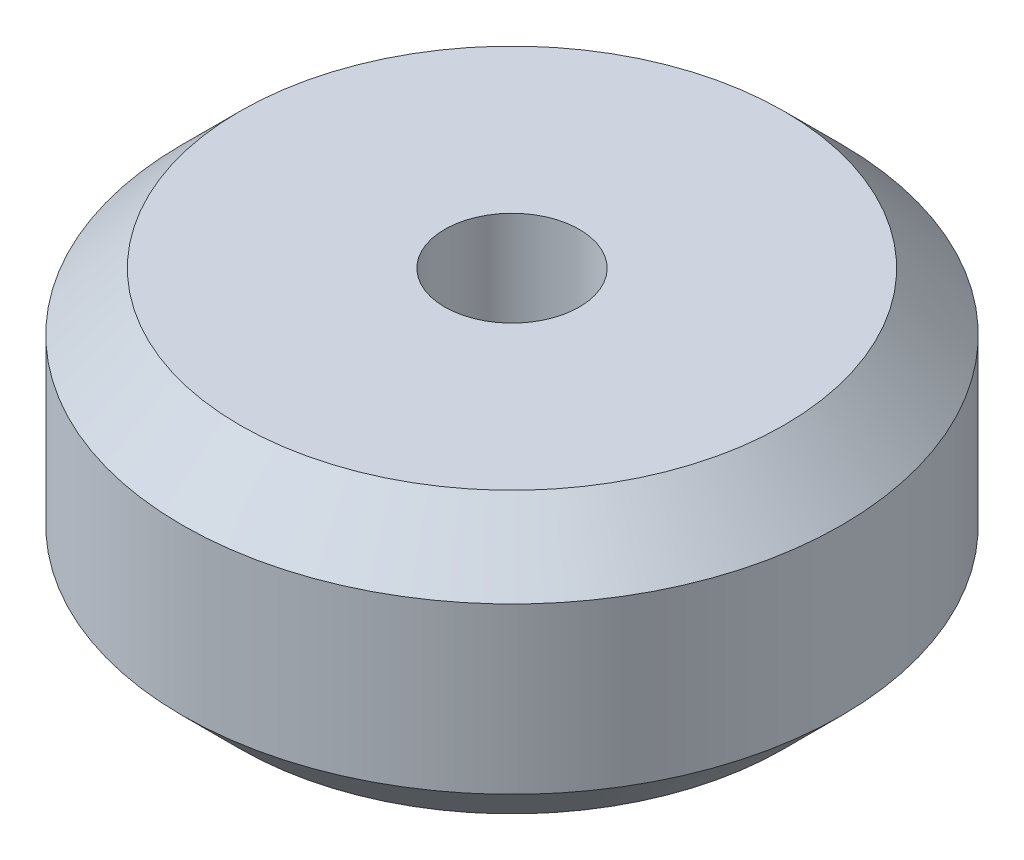
ISO-10303-21;
HEADER;
FILE_DESCRIPTION(('STEP AP214'),'2;1');
FILE_NAME('part.step','',(''),(''),'','','');
FILE_SCHEMA(('AUTOMOTIVE_DESIGN { 1 0 10303 214 1 1 1 1 }'));
ENDSEC;
DATA;
#1=APPLICATION_CONTEXT('core data for automotive mechanical design processes');
#2=APPLICATION_PROTOCOL_DEFINITION('international standard','automotive_design',2000,#1);
#3=PRODUCT_CONTEXT('',#1,'mechanical');
#4=PRODUCT('Part','Part','',(#3));
#5=PRODUCT_RELATED_PRODUCT_CATEGORY('part','',(#4));
#6=PRODUCT_DEFINITION_FORMATION('','',#4);
#7=PRODUCT_DEFINITION_CONTEXT('part definition',#1,'design');
#8=PRODUCT_DEFINITION('design','',#6,#7);
#9=PRODUCT_DEFINITION_SHAPE('','',#8);
#10=(LENGTH_UNIT() NAMED_UNIT(*) SI_UNIT(.MILLI.,.METRE.));
#11=(NAMED_UNIT(*) PLANE_ANGLE_UNIT() SI_UNIT($,.RADIAN.));
#12=(NAMED_UNIT(*) SI_UNIT($,.STERADIAN.) SOLID_ANGLE_UNIT());
#13=UNCERTAINTY_MEASURE_WITH_UNIT(LENGTH_MEASURE(1.E-05),#10,'distance_accuracy_value','');
#14=(GEOMETRIC_REPRESENTATION_CONTEXT(3) GLOBAL_UNCERTAINTY_ASSIGNED_CONTEXT((#13)) GLOBAL_UNIT_ASSIGNED_CONTEXT((#10,
#11,#12)) REPRESENTATION_CONTEXT('',''));
#15=CARTESIAN_POINT('',(0.,0.,0.));
#16=DIRECTION('',(0.,0.,1.));
#17=DIRECTION('',(1.,0.,0.));
#18=AXIS2_PLACEMENT_3D('',#15,#16,#17);
#19=CARTESIAN_POINT('',(0.,5.1,0.));
#20=DIRECTION('',(0.,-1.,0.));
#21=DIRECTION('',(0.,0.,-1.));
#22=AXIS2_PLACEMENT_3D('',#19,#20,#21);
#23=CYLINDRICAL_SURFACE('',#22,12.);
#24=CARTESIAN_POINT('',(0.,-3.,0.));
#25=DIRECTION('',(0.,1.,0.));
#26=DIRECTION('',(0.,0.,1.));
#27=AXIS2_PLACEMENT_3D('',#24,#25,#26);
#28=CIRCLE('',#27,12.);
#29=CARTESIAN_POINT('',(0.,-3.,12.));
#30=VERTEX_POINT('',#29);
#31=EDGE_CURVE('E46',#30,#30,#28,.T.);
#32=ORIENTED_EDGE('',*,*,#31,.T.);
#33=EDGE_LOOP('',(#32));
#34=FACE_BOUND('',#33,.T.);
#35=CARTESIAN_POINT('',(0.,2.99999999999999,0.));
#36=DIRECTION('',(0.,1.,0.));
#37=DIRECTION('',(0.,0.,1.));
#38=AXIS2_PLACEMENT_3D('',#35,#36,#37);
#39=CIRCLE('',#38,12.);
#40=CARTESIAN_POINT('',(0.,2.99999999999999,-12.));
#41=VERTEX_POINT('',#40);
#42=EDGE_CURVE('E50',#41,#41,#39,.F.);
#43=ORIENTED_EDGE('',*,*,#42,.T.);
#44=EDGE_LOOP('',(#43));
#45=FACE_BOUND('',#44,.T.);
#46=ADVANCED_FACE('F34',(#34,#45),#23,.T.);
#47=CARTESIAN_POINT('',(0.,5.1,0.));
#48=DIRECTION('',(0.,1.,0.));
#49=DIRECTION('',(0.,0.,1.));
#50=AXIS2_PLACEMENT_3D('',#47,#48,#49);
#51=PLANE('',#50);
#52=CARTESIAN_POINT('',(0.,5.1,0.));
#53=DIRECTION('',(0.,1.,0.));
#54=DIRECTION('',(0.,0.,1.));
#55=AXIS2_PLACEMENT_3D('',#52,#53,#54);
#56=CIRCLE('',#55,2.45);
#57=CARTESIAN_POINT('',(0.,5.1,2.45));
#58=VERTEX_POINT('',#57);
#59=EDGE_CURVE('E58',#58,#58,#56,.T.);
#60=ORIENTED_EDGE('',*,*,#59,.F.);
#61=EDGE_LOOP('',(#60));
#62=FACE_BOUND('',#61,.T.);
#63=CARTESIAN_POINT('',(0.,5.1,0.));
#64=DIRECTION('',(0.,1.,0.));
#65=DIRECTION('',(0.,0.,1.));
#66=AXIS2_PLACEMENT_3D('',#63,#64,#65);
#67=CIRCLE('',#66,9.9);
#68=CARTESIAN_POINT('',(0.,5.1,-9.9));
#69=VERTEX_POINT('',#68);
#70=EDGE_CURVE('E10',#69,#69,#67,.T.);
#71=ORIENTED_EDGE('',*,*,#70,.T.);
#72=EDGE_LOOP('',(#71));
#73=FACE_BOUND('',#72,.T.);
#74=ADVANCED_FACE('F64',(#62,#73),#51,.T.);
#75=CARTESIAN_POINT('',(0.,-5.1,0.));
#76=DIRECTION('',(0.,1.,0.));
#77=DIRECTION('',(0.,0.,1.));
#78=AXIS2_PLACEMENT_3D('',#75,#76,#77);
#79=PLANE('',#78);
#80=CARTESIAN_POINT('',(0.,-5.1,0.));
#81=DIRECTION('',(0.,1.,0.));
#82=DIRECTION('',(0.,0.,1.));
#83=AXIS2_PLACEMENT_3D('',#80,#81,#82);
#84=CIRCLE('',#83,2.45);
#85=CARTESIAN_POINT('',(0.,-5.1,2.45));
#86=VERTEX_POINT('',#85);
#87=EDGE_CURVE('E55',#86,#86,#84,.T.);
#88=ORIENTED_EDGE('',*,*,#87,.T.);
#89=EDGE_LOOP('',(#88));
#90=FACE_BOUND('',#89,.T.);
#91=CARTESIAN_POINT('',(0.,-5.1,0.));
#92=DIRECTION('',(0.,1.,0.));
#93=DIRECTION('',(0.,0.,1.));
#94=AXIS2_PLACEMENT_3D('',#91,#92,#93);
#95=CIRCLE('',#94,9.9);
#96=CARTESIAN_POINT('',(0.,-5.1,9.9));
#97=VERTEX_POINT('',#96);
#98=EDGE_CURVE('E42',#97,#97,#95,.F.);
#99=ORIENTED_EDGE('',*,*,#98,.T.);
#100=EDGE_LOOP('',(#99));
#101=FACE_BOUND('',#100,.T.);
#102=ADVANCED_FACE('F66',(#90,#101),#79,.F.);
#103=CARTESIAN_POINT('',(0.,-3.,0.));
#104=DIRECTION('',(0.,1.,0.));
#105=DIRECTION('',(0.,0.,1.));
#106=AXIS2_PLACEMENT_3D('',#103,#104,#105);
#107=CONICAL_SURFACE('',#106,12.,0.78539816339745);
#108=ORIENTED_EDGE('',*,*,#98,.F.);
#109=EDGE_LOOP('',(#108));
#110=FACE_BOUND('',#109,.T.);
#111=ORIENTED_EDGE('',*,*,#31,.F.);
#112=EDGE_LOOP('',(#111));
#113=FACE_BOUND('',#112,.T.);
#114=ADVANCED_FACE('F72',(#110,#113),#107,.T.);
#115=CARTESIAN_POINT('',(0.,5.1,0.));
#116=DIRECTION('',(0.,-1.,0.));
#117=DIRECTION('',(0.,0.,-1.));
#118=AXIS2_PLACEMENT_3D('',#115,#116,#117);
#119=CONICAL_SURFACE('',#118,9.9,0.785398163397446);
#120=CARTESIAN_POINT('',(0.,2.99999999999999,-12.));
#121=CARTESIAN_POINT('',(0.,3.02187499999999,-11.978125));
#122=CARTESIAN_POINT('',(0.,3.04374999999999,-11.95625));
#123=CARTESIAN_POINT('',(0.,3.08749999999999,-11.9125));
#124=CARTESIAN_POINT('',(0.,3.10937499999999,-11.890625));
#125=CARTESIAN_POINT('',(0.,3.15312499999999,-11.846875));
#126=CARTESIAN_POINT('',(0.,3.17499999999999,-11.825));
#127=CARTESIAN_POINT('',(0.,3.21874999999999,-11.78125));
#128=CARTESIAN_POINT('',(0.,3.24062499999999,-11.759375));
#129=CARTESIAN_POINT('',(0.,3.28437499999999,-11.715625));
#130=CARTESIAN_POINT('',(0.,3.30624999999999,-11.69375));
#131=CARTESIAN_POINT('',(0.,3.34999999999999,-11.65));
#132=CARTESIAN_POINT('',(0.,3.37187499999999,-11.628125));
#133=CARTESIAN_POINT('',(0.,3.41562499999999,-11.584375));
#134=CARTESIAN_POINT('',(0.,3.43749999999999,-11.5625));
#135=CARTESIAN_POINT('',(0.,3.48124999999999,-11.51875));
#136=CARTESIAN_POINT('',(0.,3.50312499999999,-11.496875));
#137=CARTESIAN_POINT('',(0.,3.54687499999999,-11.453125));
#138=CARTESIAN_POINT('',(0.,3.56874999999999,-11.43125));
#139=CARTESIAN_POINT('',(0.,3.61249999999999,-11.3875));
#140=CARTESIAN_POINT('',(0.,3.63437499999999,-11.365625));
#141=CARTESIAN_POINT('',(0.,3.67812499999999,-11.321875));
#142=CARTESIAN_POINT('',(0.,3.69999999999999,-11.3));
#143=CARTESIAN_POINT('',(0.,3.74374999999999,-11.25625));
#144=CARTESIAN_POINT('',(0.,3.76562499999999,-11.234375));
#145=CARTESIAN_POINT('',(0.,3.80937499999999,-11.190625));
#146=CARTESIAN_POINT('',(0.,3.83124999999999,-11.16875));
#147=CARTESIAN_POINT('',(0.,3.87499999999999,-11.125));
#148=CARTESIAN_POINT('',(0.,3.89687499999999,-11.103125));
#149=CARTESIAN_POINT('',(0.,3.94062499999999,-11.059375));
#150=CARTESIAN_POINT('',(0.,3.96249999999999,-11.0375));
#151=CARTESIAN_POINT('',(0.,4.00624999999999,-10.99375));
#152=CARTESIAN_POINT('',(0.,4.02812499999999,-10.971875));
#153=CARTESIAN_POINT('',(0.,4.071875,-10.928125));
#154=CARTESIAN_POINT('',(0.,4.09374999999999,-10.90625));
#155=CARTESIAN_POINT('',(0.,4.13749999999999,-10.8625));
#156=CARTESIAN_POINT('',(0.,4.15937499999999,-10.840625));
#157=CARTESIAN_POINT('',(0.,4.20312499999999,-10.796875));
#158=CARTESIAN_POINT('',(0.,4.22499999999999,-10.775));
#159=CARTESIAN_POINT('',(0.,4.26874999999999,-10.73125));
#160=CARTESIAN_POINT('',(0.,4.290625,-10.709375));
#161=CARTESIAN_POINT('',(0.,4.334375,-10.665625));
#162=CARTESIAN_POINT('',(0.,4.35625,-10.64375));
#163=CARTESIAN_POINT('',(0.,4.4,-10.6));
#164=CARTESIAN_POINT('',(0.,4.421875,-10.578125));
#165=CARTESIAN_POINT('',(0.,4.465625,-10.534375));
#166=CARTESIAN_POINT('',(0.,4.4875,-10.5125));
#167=CARTESIAN_POINT('',(0.,4.53125,-10.46875));
#168=CARTESIAN_POINT('',(0.,4.553125,-10.446875));
#169=CARTESIAN_POINT('',(0.,4.596875,-10.403125));
#170=CARTESIAN_POINT('',(0.,4.61875,-10.38125));
#171=CARTESIAN_POINT('',(0.,4.6625,-10.3375));
#172=CARTESIAN_POINT('',(0.,4.684375,-10.315625));
#173=CARTESIAN_POINT('',(0.,4.728125,-10.271875));
#174=CARTESIAN_POINT('',(0.,4.75,-10.25));
#175=CARTESIAN_POINT('',(0.,4.79375,-10.20625));
#176=CARTESIAN_POINT('',(0.,4.815625,-10.184375));
#177=CARTESIAN_POINT('',(0.,4.859375,-10.140625));
#178=CARTESIAN_POINT('',(0.,4.88125,-10.11875));
#179=CARTESIAN_POINT('',(0.,4.925,-10.075));
#180=CARTESIAN_POINT('',(0.,4.946875,-10.053125));
#181=CARTESIAN_POINT('',(0.,4.990625,-10.009375));
#182=CARTESIAN_POINT('',(0.,5.0125,-9.9875));
#183=CARTESIAN_POINT('',(0.,5.05625,-9.94375));
#184=CARTESIAN_POINT('',(0.,5.078125,-9.921875));
#185=CARTESIAN_POINT('',(0.,5.1,-9.9));
#186=B_SPLINE_CURVE_WITH_KNOTS('',3,(#120,#121,#122,#123,#124,#125,#126,#127,#128,#129,#130,
#131,#132,#133,#134,#135,#136,#137,#138,#139,#140,#141,#142,#143,#144,#145,#146,#147,#148,#149,
#150,#151,#152,#153,#154,#155,#156,#157,#158,#159,#160,#161,#162,#163,#164,#165,#166,#167,#168,
#169,#170,#171,#172,#173,#174,#175,#176,#177,#178,#179,#180,#181,#182,#183,#184,#185),
.UNSPECIFIED.,.F.,.F.,(4,2,2,2,2,2,2,2,2,2,2,2,2,2,2,2,2,2,2,2,2,2,2,2,2,2,2,2,2,2,2,2,4),(0.,
0.0928077650307343,0.18561553006147,0.278423295092204,0.371231060122939,0.464038825153673,
0.556846590184408,0.649654355215143,0.742462120245878,0.835269885276612,0.928077650307346,
1.02088541533808,1.11369318036882,1.20650094539955,1.29930871043028,1.39211647546102,
1.48492424049175,1.57773200552249,1.67053977055322,1.76334753558396,1.85615530061469,
1.94896306564543,2.04177083067616,2.1345785957069,2.22738636073763,2.32019412576837,
2.4130018907991,2.50580965582983,2.59861742086057,2.6914251858913,2.78423295092204,
2.87704071595277,2.96984848098351),.UNSPECIFIED.);
#187=EDGE_CURVE('BSEAM37',#41,#69,#186,.T.);
#188=ORIENTED_EDGE('',*,*,#42,.F.);
#189=ORIENTED_EDGE('',*,*,#70,.F.);
#190=ORIENTED_EDGE('',*,*,#187,.T.);
#191=ORIENTED_EDGE('',*,*,#187,.F.);
#192=EDGE_LOOP('',(#188,#190,#189,#191));
#193=FACE_BOUND('',#192,.T.);
#194=ADVANCED_FACE('F37',(#193),#119,.T.);
#195=CARTESIAN_POINT('',(0.,-5.1,0.));
#196=DIRECTION('',(0.,1.,0.));
#197=DIRECTION('',(0.,0.,1.));
#198=AXIS2_PLACEMENT_3D('',#195,#196,#197);
#199=CYLINDRICAL_SURFACE('',#198,2.45);
#200=ORIENTED_EDGE('',*,*,#87,.F.);
#201=EDGE_LOOP('',(#200));
#202=FACE_BOUND('',#201,.T.);
#203=ORIENTED_EDGE('',*,*,#59,.T.);
#204=EDGE_LOOP('',(#203));
#205=FACE_BOUND('',#204,.T.);
#206=ADVANCED_FACE('F62',(#202,#205),#199,.F.);
#207=CLOSED_SHELL('',(#46,#74,#102,#114,#194,#206));
#208=MANIFOLD_SOLID_BREP('B2',#207);
#209=ADVANCED_BREP_SHAPE_REPRESENTATION('',(#18,#208),#14);
#210=SHAPE_DEFINITION_REPRESENTATION(#9,#209);
ENDSEC;
END-ISO-10303-21;
